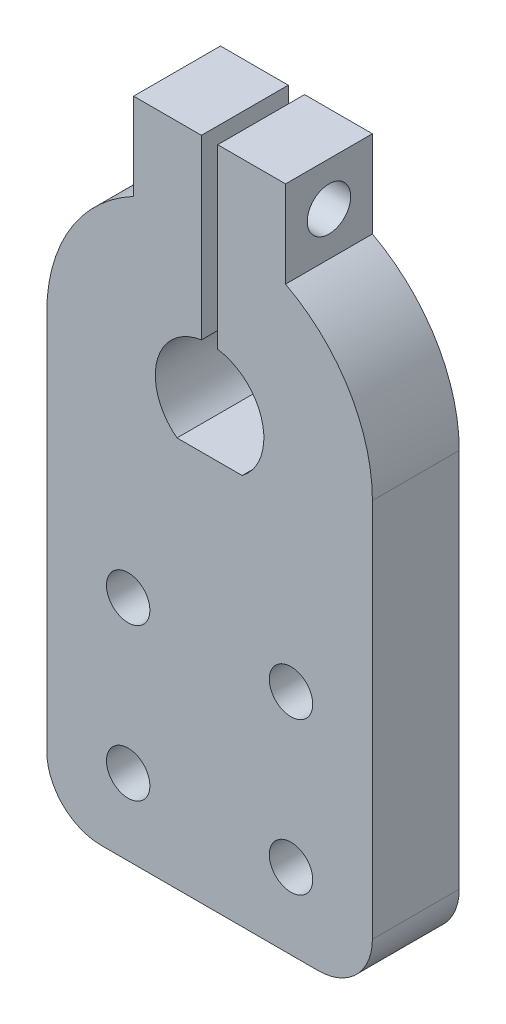
ISO-10303-21;
HEADER;
FILE_DESCRIPTION(('STEP AP214'),'2;1');
FILE_NAME('part.step','',(''),(''),'','','');
FILE_SCHEMA(('AUTOMOTIVE_DESIGN { 1 0 10303 214 1 1 1 1 }'));
ENDSEC;
DATA;
#1=APPLICATION_CONTEXT('core data for automotive mechanical design processes');
#2=APPLICATION_PROTOCOL_DEFINITION('international standard','automotive_design',2000,#1);
#3=PRODUCT_CONTEXT('',#1,'mechanical');
#4=PRODUCT('Part','Part','',(#3));
#5=PRODUCT_RELATED_PRODUCT_CATEGORY('part','',(#4));
#6=PRODUCT_DEFINITION_FORMATION('','',#4);
#7=PRODUCT_DEFINITION_CONTEXT('part definition',#1,'design');
#8=PRODUCT_DEFINITION('design','',#6,#7);
#9=PRODUCT_DEFINITION_SHAPE('','',#8);
#10=(LENGTH_UNIT() NAMED_UNIT(*) SI_UNIT(.MILLI.,.METRE.));
#11=(NAMED_UNIT(*) PLANE_ANGLE_UNIT() SI_UNIT($,.RADIAN.));
#12=(NAMED_UNIT(*) SI_UNIT($,.STERADIAN.) SOLID_ANGLE_UNIT());
#13=UNCERTAINTY_MEASURE_WITH_UNIT(LENGTH_MEASURE(1.E-05),#10,'distance_accuracy_value','');
#14=(GEOMETRIC_REPRESENTATION_CONTEXT(3) GLOBAL_UNCERTAINTY_ASSIGNED_CONTEXT((#13)) GLOBAL_UNIT_ASSIGNED_CONTEXT((#10,
#11,#12)) REPRESENTATION_CONTEXT('',''));
#15=CARTESIAN_POINT('',(0.,0.,0.));
#16=DIRECTION('',(0.,0.,1.));
#17=DIRECTION('',(1.,0.,0.));
#18=AXIS2_PLACEMENT_3D('',#15,#16,#17);
#19=CARTESIAN_POINT('',(0.,0.,8.));
#20=DIRECTION('',(0.,0.,1.));
#21=DIRECTION('',(1.,0.,0.));
#22=AXIS2_PLACEMENT_3D('',#19,#20,#21);
#23=PLANE('',#22);
#24=CARTESIAN_POINT('',(7.5,-33.,8.));
#25=DIRECTION('',(0.,0.,1.));
#26=DIRECTION('',(-1.,0.,0.));
#27=AXIS2_PLACEMENT_3D('',#24,#25,#26);
#28=CIRCLE('',#27,2.);
#29=CARTESIAN_POINT('',(5.5,-33.,8.));
#30=VERTEX_POINT('',#29);
#31=EDGE_CURVE('E549',#30,#30,#28,.T.);
#32=ORIENTED_EDGE('',*,*,#31,.F.);
#33=EDGE_LOOP('',(#32));
#34=FACE_BOUND('',#33,.T.);
#35=CARTESIAN_POINT('',(-7.5,-19.,8.));
#36=DIRECTION('',(0.,0.,1.));
#37=DIRECTION('',(1.,0.,0.));
#38=AXIS2_PLACEMENT_3D('',#35,#36,#37);
#39=CIRCLE('',#38,2.);
#40=CARTESIAN_POINT('',(-5.5,-19.,8.));
#41=VERTEX_POINT('',#40);
#42=EDGE_CURVE('E298',#41,#41,#39,.T.);
#43=ORIENTED_EDGE('',*,*,#42,.F.);
#44=EDGE_LOOP('',(#43));
#45=FACE_BOUND('',#44,.T.);
#46=DIRECTION('',(0.,-1.,0.));
#47=VECTOR('',#46,1.);
#48=CARTESIAN_POINT('',(-15.,0.,8.));
#49=LINE('',#48,#47);
#50=CARTESIAN_POINT('',(-15.,0.,8.));
#51=VERTEX_POINT('',#50);
#52=CARTESIAN_POINT('',(-15.,-35.,8.));
#53=VERTEX_POINT('',#52);
#54=EDGE_CURVE('E195',#51,#53,#49,.T.);
#55=ORIENTED_EDGE('',*,*,#54,.T.);
#56=CARTESIAN_POINT('',(-10.,-35.,8.));
#57=DIRECTION('',(0.,0.,1.));
#58=DIRECTION('',(1.,0.,0.));
#59=AXIS2_PLACEMENT_3D('',#56,#57,#58);
#60=CIRCLE('',#59,5.);
#61=CARTESIAN_POINT('',(-10.,-40.,8.));
#62=VERTEX_POINT('',#61);
#63=EDGE_CURVE('E45',#53,#62,#60,.T.);
#64=ORIENTED_EDGE('',*,*,#63,.T.);
#65=DIRECTION('',(1.,0.,0.));
#66=VECTOR('',#65,1.);
#67=CARTESIAN_POINT('',(-15.,-40.,8.));
#68=LINE('',#67,#66);
#69=CARTESIAN_POINT('',(10.,-40.,8.));
#70=VERTEX_POINT('',#69);
#71=EDGE_CURVE('E194',#62,#70,#68,.T.);
#72=ORIENTED_EDGE('',*,*,#71,.T.);
#73=CARTESIAN_POINT('',(10.,-35.,8.));
#74=DIRECTION('',(0.,0.,1.));
#75=DIRECTION('',(1.,0.,0.));
#76=AXIS2_PLACEMENT_3D('',#73,#74,#75);
#77=CIRCLE('',#76,5.);
#78=CARTESIAN_POINT('',(15.,-35.,8.));
#79=VERTEX_POINT('',#78);
#80=EDGE_CURVE('E52',#70,#79,#77,.T.);
#81=ORIENTED_EDGE('',*,*,#80,.T.);
#82=DIRECTION('',(0.,1.,0.));
#83=VECTOR('',#82,1.);
#84=CARTESIAN_POINT('',(15.,-40.,8.));
#85=LINE('',#84,#83);
#86=CARTESIAN_POINT('',(15.,0.,8.));
#87=VERTEX_POINT('',#86);
#88=EDGE_CURVE('E203',#79,#87,#85,.T.);
#89=ORIENTED_EDGE('',*,*,#88,.T.);
#90=CARTESIAN_POINT('',(0.,0.,8.));
#91=DIRECTION('',(0.,0.,1.));
#92=DIRECTION('',(1.,0.,0.));
#93=AXIS2_PLACEMENT_3D('',#90,#91,#92);
#94=CIRCLE('',#93,15.);
#95=CARTESIAN_POINT('',(7.,13.2664991614216,8.));
#96=VERTEX_POINT('',#95);
#97=EDGE_CURVE('E295',#87,#96,#94,.T.);
#98=ORIENTED_EDGE('',*,*,#97,.T.);
#99=DIRECTION('',(0.,1.,0.));
#100=VECTOR('',#99,1.);
#101=CARTESIAN_POINT('',(7.,21.2664991614216,8.));
#102=LINE('',#101,#100);
#103=CARTESIAN_POINT('',(7.,21.2664991614216,8.));
#104=VERTEX_POINT('',#103);
#105=EDGE_CURVE('E168',#96,#104,#102,.T.);
#106=ORIENTED_EDGE('',*,*,#105,.T.);
#107=DIRECTION('',(-1.,0.,0.));
#108=VECTOR('',#107,1.);
#109=CARTESIAN_POINT('',(7.,21.2664991614216,8.));
#110=LINE('',#109,#108);
#111=CARTESIAN_POINT('',(0.750000000000002,21.2664991614216,8.));
#112=VERTEX_POINT('',#111);
#113=EDGE_CURVE('E163',#104,#112,#110,.T.);
#114=ORIENTED_EDGE('',*,*,#113,.T.);
#115=DIRECTION('',(0.,-1.,0.));
#116=VECTOR('',#115,1.);
#117=CARTESIAN_POINT('',(0.750000000000002,21.2664991614216,8.));
#118=LINE('',#117,#116);
#119=CARTESIAN_POINT('',(0.750000000000002,4.9434299833213,8.));
#120=VERTEX_POINT('',#119);
#121=EDGE_CURVE('E153',#112,#120,#118,.T.);
#122=ORIENTED_EDGE('',*,*,#121,.T.);
#123=CARTESIAN_POINT('',(0.,0.,8.));
#124=DIRECTION('',(0.,0.,-1.));
#125=DIRECTION('',(1.,0.,0.));
#126=AXIS2_PLACEMENT_3D('',#123,#124,#125);
#127=CIRCLE('',#126,5.);
#128=CARTESIAN_POINT('',(3.,-4.,8.));
#129=VERTEX_POINT('',#128);
#130=EDGE_CURVE('E162',#120,#129,#127,.T.);
#131=ORIENTED_EDGE('',*,*,#130,.T.);
#132=DIRECTION('',(-1.,0.,0.));
#133=VECTOR('',#132,1.);
#134=CARTESIAN_POINT('',(3.,-4.,8.));
#135=LINE('',#134,#133);
#136=CARTESIAN_POINT('',(-3.,-4.,8.));
#137=VERTEX_POINT('',#136);
#138=EDGE_CURVE('E260',#129,#137,#135,.T.);
#139=ORIENTED_EDGE('',*,*,#138,.T.);
#140=CARTESIAN_POINT('',(0.,0.,8.));
#141=DIRECTION('',(0.,0.,-1.));
#142=DIRECTION('',(1.,0.,0.));
#143=AXIS2_PLACEMENT_3D('',#140,#141,#142);
#144=CIRCLE('',#143,5.);
#145=CARTESIAN_POINT('',(-0.75,4.9434299833213,8.));
#146=VERTEX_POINT('',#145);
#147=EDGE_CURVE('E301',#137,#146,#144,.T.);
#148=ORIENTED_EDGE('',*,*,#147,.T.);
#149=DIRECTION('',(0.,1.,0.));
#150=VECTOR('',#149,1.);
#151=CARTESIAN_POINT('',(-0.750000000000002,21.2664991614216,8.));
#152=LINE('',#151,#150);
#153=CARTESIAN_POINT('',(-0.750000000000002,21.2664991614216,8.));
#154=VERTEX_POINT('',#153);
#155=EDGE_CURVE('E305',#146,#154,#152,.T.);
#156=ORIENTED_EDGE('',*,*,#155,.T.);
#157=DIRECTION('',(-1.,0.,0.));
#158=VECTOR('',#157,1.);
#159=CARTESIAN_POINT('',(-7.,21.2664991614216,8.));
#160=LINE('',#159,#158);
#161=CARTESIAN_POINT('',(-7.,21.2664991614216,8.));
#162=VERTEX_POINT('',#161);
#163=EDGE_CURVE('E290',#154,#162,#160,.T.);
#164=ORIENTED_EDGE('',*,*,#163,.T.);
#165=DIRECTION('',(0.,-1.,0.));
#166=VECTOR('',#165,1.);
#167=CARTESIAN_POINT('',(-7.,21.2664991614216,8.));
#168=LINE('',#167,#166);
#169=CARTESIAN_POINT('',(-7.,13.2664991614216,8.));
#170=VERTEX_POINT('',#169);
#171=EDGE_CURVE('E287',#162,#170,#168,.T.);
#172=ORIENTED_EDGE('',*,*,#171,.T.);
#173=CARTESIAN_POINT('',(0.,0.,8.));
#174=DIRECTION('',(0.,0.,1.));
#175=DIRECTION('',(1.,0.,0.));
#176=AXIS2_PLACEMENT_3D('',#173,#174,#175);
#177=CIRCLE('',#176,15.);
#178=EDGE_CURVE('E286',#170,#51,#177,.T.);
#179=ORIENTED_EDGE('',*,*,#178,.T.);
#180=EDGE_LOOP('',(#55,#64,#72,#81,#89,#98,#106,#114,#122,#131,#139,#148,#156,#164,#172,#179));
#181=FACE_BOUND('',#180,.T.);
#182=CARTESIAN_POINT('',(-7.5,-33.,8.));
#183=DIRECTION('',(0.,0.,1.));
#184=DIRECTION('',(1.,0.,0.));
#185=AXIS2_PLACEMENT_3D('',#182,#183,#184);
#186=CIRCLE('',#185,2.);
#187=CARTESIAN_POINT('',(-5.5,-33.,8.));
#188=VERTEX_POINT('',#187);
#189=EDGE_CURVE('E555',#188,#188,#186,.T.);
#190=ORIENTED_EDGE('',*,*,#189,.F.);
#191=EDGE_LOOP('',(#190));
#192=FACE_BOUND('',#191,.T.);
#193=CARTESIAN_POINT('',(7.5,-19.,8.));
#194=DIRECTION('',(0.,0.,1.));
#195=DIRECTION('',(-1.,0.,0.));
#196=AXIS2_PLACEMENT_3D('',#193,#194,#195);
#197=CIRCLE('',#196,2.);
#198=CARTESIAN_POINT('',(5.5,-19.,8.));
#199=VERTEX_POINT('',#198);
#200=EDGE_CURVE('E539',#199,#199,#197,.T.);
#201=ORIENTED_EDGE('',*,*,#200,.F.);
#202=EDGE_LOOP('',(#201));
#203=FACE_BOUND('',#202,.T.);
#204=ADVANCED_FACE('F37',(#34,#45,#181,#192,#203),#23,.T.);
#205=CARTESIAN_POINT('',(0.,0.,0.));
#206=DIRECTION('',(0.,0.,1.));
#207=DIRECTION('',(1.,0.,0.));
#208=AXIS2_PLACEMENT_3D('',#205,#206,#207);
#209=PLANE('',#208);
#210=DIRECTION('',(1.,0.,0.));
#211=VECTOR('',#210,1.);
#212=CARTESIAN_POINT('',(-15.,-40.,0.));
#213=LINE('',#212,#211);
#214=CARTESIAN_POINT('',(-10.,-40.,0.));
#215=VERTEX_POINT('',#214);
#216=CARTESIAN_POINT('',(10.,-40.,0.));
#217=VERTEX_POINT('',#216);
#218=EDGE_CURVE('E212',#215,#217,#213,.T.);
#219=ORIENTED_EDGE('',*,*,#218,.F.);
#220=CARTESIAN_POINT('',(-10.,-35.,0.));
#221=DIRECTION('',(0.,0.,1.));
#222=DIRECTION('',(1.,0.,0.));
#223=AXIS2_PLACEMENT_3D('',#220,#221,#222);
#224=CIRCLE('',#223,5.);
#225=CARTESIAN_POINT('',(-15.,-35.,0.));
#226=VERTEX_POINT('',#225);
#227=EDGE_CURVE('E189',#215,#226,#224,.F.);
#228=ORIENTED_EDGE('',*,*,#227,.T.);
#229=DIRECTION('',(0.,-1.,0.));
#230=VECTOR('',#229,1.);
#231=CARTESIAN_POINT('',(-15.,0.,0.));
#232=LINE('',#231,#230);
#233=CARTESIAN_POINT('',(-15.,0.,0.));
#234=VERTEX_POINT('',#233);
#235=EDGE_CURVE('E211',#234,#226,#232,.T.);
#236=ORIENTED_EDGE('',*,*,#235,.F.);
#237=CARTESIAN_POINT('',(0.,0.,0.));
#238=DIRECTION('',(0.,0.,1.));
#239=DIRECTION('',(1.,0.,0.));
#240=AXIS2_PLACEMENT_3D('',#237,#238,#239);
#241=CIRCLE('',#240,15.);
#242=CARTESIAN_POINT('',(-7.,13.2664991614216,0.));
#243=VERTEX_POINT('',#242);
#244=EDGE_CURVE('E217',#243,#234,#241,.T.);
#245=ORIENTED_EDGE('',*,*,#244,.F.);
#246=DIRECTION('',(0.,-1.,0.));
#247=VECTOR('',#246,1.);
#248=CARTESIAN_POINT('',(-7.,21.2664991614216,0.));
#249=LINE('',#248,#247);
#250=CARTESIAN_POINT('',(-7.,21.2664991614216,0.));
#251=VERTEX_POINT('',#250);
#252=EDGE_CURVE('E221',#251,#243,#249,.T.);
#253=ORIENTED_EDGE('',*,*,#252,.F.);
#254=DIRECTION('',(-1.,0.,0.));
#255=VECTOR('',#254,1.);
#256=CARTESIAN_POINT('',(-7.,21.2664991614216,0.));
#257=LINE('',#256,#255);
#258=CARTESIAN_POINT('',(-0.750000000000002,21.2664991614216,0.));
#259=VERTEX_POINT('',#258);
#260=EDGE_CURVE('E275',#259,#251,#257,.T.);
#261=ORIENTED_EDGE('',*,*,#260,.F.);
#262=DIRECTION('',(0.,1.,0.));
#263=VECTOR('',#262,1.);
#264=CARTESIAN_POINT('',(-0.750000000000002,21.2664991614216,0.));
#265=LINE('',#264,#263);
#266=CARTESIAN_POINT('',(-0.75,4.9434299833213,0.));
#267=VERTEX_POINT('',#266);
#268=EDGE_CURVE('E268',#267,#259,#265,.T.);
#269=ORIENTED_EDGE('',*,*,#268,.F.);
#270=CARTESIAN_POINT('',(0.,0.,0.));
#271=DIRECTION('',(0.,0.,-1.));
#272=DIRECTION('',(1.,0.,0.));
#273=AXIS2_PLACEMENT_3D('',#270,#271,#272);
#274=CIRCLE('',#273,5.);
#275=CARTESIAN_POINT('',(-3.,-4.,0.));
#276=VERTEX_POINT('',#275);
#277=EDGE_CURVE('E266',#276,#267,#274,.T.);
#278=ORIENTED_EDGE('',*,*,#277,.F.);
#279=DIRECTION('',(-1.,0.,0.));
#280=VECTOR('',#279,1.);
#281=CARTESIAN_POINT('',(3.,-4.,0.));
#282=LINE('',#281,#280);
#283=CARTESIAN_POINT('',(3.,-4.,0.));
#284=VERTEX_POINT('',#283);
#285=EDGE_CURVE('E259',#284,#276,#282,.T.);
#286=ORIENTED_EDGE('',*,*,#285,.F.);
#287=CARTESIAN_POINT('',(0.,0.,0.));
#288=DIRECTION('',(0.,0.,-1.));
#289=DIRECTION('',(1.,0.,0.));
#290=AXIS2_PLACEMENT_3D('',#287,#288,#289);
#291=CIRCLE('',#290,5.);
#292=CARTESIAN_POINT('',(0.750000000000002,4.9434299833213,0.));
#293=VERTEX_POINT('',#292);
#294=EDGE_CURVE('E264',#293,#284,#291,.T.);
#295=ORIENTED_EDGE('',*,*,#294,.F.);
#296=DIRECTION('',(0.,-1.,0.));
#297=VECTOR('',#296,1.);
#298=CARTESIAN_POINT('',(0.750000000000002,21.2664991614216,0.));
#299=LINE('',#298,#297);
#300=CARTESIAN_POINT('',(0.750000000000002,21.2664991614216,0.));
#301=VERTEX_POINT('',#300);
#302=EDGE_CURVE('E270',#301,#293,#299,.T.);
#303=ORIENTED_EDGE('',*,*,#302,.F.);
#304=DIRECTION('',(-1.,0.,0.));
#305=VECTOR('',#304,1.);
#306=CARTESIAN_POINT('',(7.,21.2664991614216,0.));
#307=LINE('',#306,#305);
#308=CARTESIAN_POINT('',(7.,21.2664991614216,0.));
#309=VERTEX_POINT('',#308);
#310=EDGE_CURVE('E176',#309,#301,#307,.T.);
#311=ORIENTED_EDGE('',*,*,#310,.F.);
#312=DIRECTION('',(0.,1.,0.));
#313=VECTOR('',#312,1.);
#314=CARTESIAN_POINT('',(7.,21.2664991614216,0.));
#315=LINE('',#314,#313);
#316=CARTESIAN_POINT('',(7.,13.2664991614216,0.));
#317=VERTEX_POINT('',#316);
#318=EDGE_CURVE('E172',#317,#309,#315,.T.);
#319=ORIENTED_EDGE('',*,*,#318,.F.);
#320=CARTESIAN_POINT('',(0.,0.,0.));
#321=DIRECTION('',(0.,0.,1.));
#322=DIRECTION('',(1.,0.,0.));
#323=AXIS2_PLACEMENT_3D('',#320,#321,#322);
#324=CIRCLE('',#323,15.);
#325=CARTESIAN_POINT('',(15.,0.,0.));
#326=VERTEX_POINT('',#325);
#327=EDGE_CURVE('E226',#326,#317,#324,.T.);
#328=ORIENTED_EDGE('',*,*,#327,.F.);
#329=DIRECTION('',(0.,1.,0.));
#330=VECTOR('',#329,1.);
#331=CARTESIAN_POINT('',(15.,-40.,0.));
#332=LINE('',#331,#330);
#333=CARTESIAN_POINT('',(15.,-35.,0.));
#334=VERTEX_POINT('',#333);
#335=EDGE_CURVE('E219',#334,#326,#332,.T.);
#336=ORIENTED_EDGE('',*,*,#335,.F.);
#337=CARTESIAN_POINT('',(10.,-35.,0.));
#338=DIRECTION('',(0.,0.,1.));
#339=DIRECTION('',(1.,0.,0.));
#340=AXIS2_PLACEMENT_3D('',#337,#338,#339);
#341=CIRCLE('',#340,5.);
#342=EDGE_CURVE('E187',#334,#217,#341,.F.);
#343=ORIENTED_EDGE('',*,*,#342,.T.);
#344=EDGE_LOOP('',(#219,#228,#236,#245,#253,#261,#269,#278,#286,#295,#303,#311,#319,#328,#336,#343));
#345=FACE_BOUND('',#344,.T.);
#346=CARTESIAN_POINT('',(-7.5,-19.,0.));
#347=DIRECTION('',(0.,0.,1.));
#348=DIRECTION('',(1.,0.,0.));
#349=AXIS2_PLACEMENT_3D('',#346,#347,#348);
#350=CIRCLE('',#349,2.);
#351=CARTESIAN_POINT('',(-5.5,-19.,0.));
#352=VERTEX_POINT('',#351);
#353=EDGE_CURVE('E558',#352,#352,#350,.T.);
#354=ORIENTED_EDGE('',*,*,#353,.T.);
#355=EDGE_LOOP('',(#354));
#356=FACE_BOUND('',#355,.T.);
#357=CARTESIAN_POINT('',(-7.5,-33.,0.));
#358=DIRECTION('',(0.,0.,1.));
#359=DIRECTION('',(1.,0.,0.));
#360=AXIS2_PLACEMENT_3D('',#357,#358,#359);
#361=CIRCLE('',#360,2.);
#362=CARTESIAN_POINT('',(-5.5,-33.,0.));
#363=VERTEX_POINT('',#362);
#364=EDGE_CURVE('E552',#363,#363,#361,.T.);
#365=ORIENTED_EDGE('',*,*,#364,.T.);
#366=EDGE_LOOP('',(#365));
#367=FACE_BOUND('',#366,.T.);
#368=CARTESIAN_POINT('',(7.5,-33.,0.));
#369=DIRECTION('',(0.,0.,1.));
#370=DIRECTION('',(-1.,0.,0.));
#371=AXIS2_PLACEMENT_3D('',#368,#369,#370);
#372=CIRCLE('',#371,2.);
#373=CARTESIAN_POINT('',(5.5,-33.,0.));
#374=VERTEX_POINT('',#373);
#375=EDGE_CURVE('E547',#374,#374,#372,.T.);
#376=ORIENTED_EDGE('',*,*,#375,.T.);
#377=EDGE_LOOP('',(#376));
#378=FACE_BOUND('',#377,.T.);
#379=CARTESIAN_POINT('',(7.5,-19.,0.));
#380=DIRECTION('',(0.,0.,1.));
#381=DIRECTION('',(-1.,0.,0.));
#382=AXIS2_PLACEMENT_3D('',#379,#380,#381);
#383=CIRCLE('',#382,2.);
#384=CARTESIAN_POINT('',(5.5,-19.,0.));
#385=VERTEX_POINT('',#384);
#386=EDGE_CURVE('E535',#385,#385,#383,.T.);
#387=ORIENTED_EDGE('',*,*,#386,.T.);
#388=EDGE_LOOP('',(#387));
#389=FACE_BOUND('',#388,.T.);
#390=ADVANCED_FACE('F208',(#345,#356,#367,#378,#389),#209,.F.);
#391=CARTESIAN_POINT('',(7.,21.2664991614216,8.));
#392=DIRECTION('',(0.,-1.,0.));
#393=DIRECTION('',(0.,0.,-1.));
#394=AXIS2_PLACEMENT_3D('',#391,#392,#393);
#395=PLANE('',#394);
#396=ORIENTED_EDGE('',*,*,#310,.T.);
#397=DIRECTION('',(0.,0.,-1.));
#398=VECTOR('',#397,1.);
#399=CARTESIAN_POINT('',(0.750000000000002,21.2664991614216,8.));
#400=LINE('',#399,#398);
#401=EDGE_CURVE('E157',#112,#301,#400,.T.);
#402=ORIENTED_EDGE('',*,*,#401,.F.);
#403=ORIENTED_EDGE('',*,*,#113,.F.);
#404=DIRECTION('',(0.,0.,-1.));
#405=VECTOR('',#404,1.);
#406=CARTESIAN_POINT('',(7.,21.2664991614216,8.));
#407=LINE('',#406,#405);
#408=EDGE_CURVE('E229',#104,#309,#407,.T.);
#409=ORIENTED_EDGE('',*,*,#408,.T.);
#410=EDGE_LOOP('',(#396,#402,#403,#409));
#411=FACE_BOUND('',#410,.T.);
#412=ADVANCED_FACE('F174',(#411),#395,.F.);
#413=CARTESIAN_POINT('',(0.750000000000002,21.2664991614216,8.));
#414=DIRECTION('',(1.,0.,0.));
#415=DIRECTION('',(0.,1.,0.));
#416=AXIS2_PLACEMENT_3D('',#413,#414,#415);
#417=PLANE('',#416);
#418=CARTESIAN_POINT('',(0.750000000000002,17.2664991614216,4.));
#419=DIRECTION('',(1.,0.,0.));
#420=DIRECTION('',(0.,1.,0.));
#421=AXIS2_PLACEMENT_3D('',#418,#419,#420);
#422=CIRCLE('',#421,2.);
#423=CARTESIAN_POINT('',(0.750000000000003,19.2664991614216,4.));
#424=VERTEX_POINT('',#423);
#425=EDGE_CURVE('E533',#424,#424,#422,.T.);
#426=ORIENTED_EDGE('',*,*,#425,.T.);
#427=EDGE_LOOP('',(#426));
#428=FACE_BOUND('',#427,.T.);
#429=ORIENTED_EDGE('',*,*,#302,.T.);
#430=DIRECTION('',(0.,0.,-1.));
#431=VECTOR('',#430,1.);
#432=CARTESIAN_POINT('',(0.750000000000002,4.9434299833213,8.));
#433=LINE('',#432,#431);
#434=EDGE_CURVE('E160',#120,#293,#433,.T.);
#435=ORIENTED_EDGE('',*,*,#434,.F.);
#436=ORIENTED_EDGE('',*,*,#121,.F.);
#437=ORIENTED_EDGE('',*,*,#401,.T.);
#438=EDGE_LOOP('',(#429,#435,#436,#437));
#439=FACE_BOUND('',#438,.T.);
#440=ADVANCED_FACE('F155',(#428,#439),#417,.F.);
#441=CARTESIAN_POINT('',(0.,0.,8.));
#442=DIRECTION('',(0.,0.,-1.));
#443=DIRECTION('',(-1.,0.,0.));
#444=AXIS2_PLACEMENT_3D('',#441,#442,#443);
#445=CYLINDRICAL_SURFACE('',#444,5.);
#446=ORIENTED_EDGE('',*,*,#294,.T.);
#447=DIRECTION('',(0.,0.,-1.));
#448=VECTOR('',#447,1.);
#449=CARTESIAN_POINT('',(3.,-4.,8.));
#450=LINE('',#449,#448);
#451=EDGE_CURVE('E181',#129,#284,#450,.T.);
#452=ORIENTED_EDGE('',*,*,#451,.F.);
#453=ORIENTED_EDGE('',*,*,#130,.F.);
#454=ORIENTED_EDGE('',*,*,#434,.T.);
#455=EDGE_LOOP('',(#446,#452,#453,#454));
#456=FACE_BOUND('',#455,.T.);
#457=ADVANCED_FACE('F299',(#456),#445,.F.);
#458=CARTESIAN_POINT('',(3.,-4.,8.));
#459=DIRECTION('',(0.,-1.,0.));
#460=DIRECTION('',(0.,0.,-1.));
#461=AXIS2_PLACEMENT_3D('',#458,#459,#460);
#462=PLANE('',#461);
#463=ORIENTED_EDGE('',*,*,#285,.T.);
#464=DIRECTION('',(0.,0.,-1.));
#465=VECTOR('',#464,1.);
#466=CARTESIAN_POINT('',(-3.,-4.,8.));
#467=LINE('',#466,#465);
#468=EDGE_CURVE('E250',#137,#276,#467,.T.);
#469=ORIENTED_EDGE('',*,*,#468,.F.);
#470=ORIENTED_EDGE('',*,*,#138,.F.);
#471=ORIENTED_EDGE('',*,*,#451,.T.);
#472=EDGE_LOOP('',(#463,#469,#470,#471));
#473=FACE_BOUND('',#472,.T.);
#474=ADVANCED_FACE('F257',(#473),#462,.F.);
#475=CARTESIAN_POINT('',(0.,0.,8.));
#476=DIRECTION('',(0.,0.,-1.));
#477=DIRECTION('',(-1.,0.,0.));
#478=AXIS2_PLACEMENT_3D('',#475,#476,#477);
#479=CYLINDRICAL_SURFACE('',#478,5.);
#480=ORIENTED_EDGE('',*,*,#277,.T.);
#481=DIRECTION('',(0.,0.,-1.));
#482=VECTOR('',#481,1.);
#483=CARTESIAN_POINT('',(-0.75,4.9434299833213,8.));
#484=LINE('',#483,#482);
#485=EDGE_CURVE('E247',#146,#267,#484,.T.);
#486=ORIENTED_EDGE('',*,*,#485,.F.);
#487=ORIENTED_EDGE('',*,*,#147,.F.);
#488=ORIENTED_EDGE('',*,*,#468,.T.);
#489=EDGE_LOOP('',(#480,#486,#487,#488));
#490=FACE_BOUND('',#489,.T.);
#491=ADVANCED_FACE('F316',(#490),#479,.F.);
#492=CARTESIAN_POINT('',(-0.750000000000002,21.2664991614216,8.));
#493=DIRECTION('',(-1.,0.,0.));
#494=DIRECTION('',(0.,-1.,0.));
#495=AXIS2_PLACEMENT_3D('',#492,#493,#494);
#496=PLANE('',#495);
#497=CARTESIAN_POINT('',(-0.750000000000002,17.2664991614216,4.));
#498=DIRECTION('',(-1.,0.,0.));
#499=DIRECTION('',(0.,-1.,0.));
#500=AXIS2_PLACEMENT_3D('',#497,#498,#499);
#501=CIRCLE('',#500,2.);
#502=CARTESIAN_POINT('',(-0.750000000000001,15.2664991614216,4.));
#503=VERTEX_POINT('',#502);
#504=EDGE_CURVE('E536',#503,#503,#501,.T.);
#505=ORIENTED_EDGE('',*,*,#504,.T.);
#506=EDGE_LOOP('',(#505));
#507=FACE_BOUND('',#506,.T.);
#508=ORIENTED_EDGE('',*,*,#268,.T.);
#509=DIRECTION('',(0.,0.,-1.));
#510=VECTOR('',#509,1.);
#511=CARTESIAN_POINT('',(-0.750000000000002,21.2664991614216,8.));
#512=LINE('',#511,#510);
#513=EDGE_CURVE('E244',#154,#259,#512,.T.);
#514=ORIENTED_EDGE('',*,*,#513,.F.);
#515=ORIENTED_EDGE('',*,*,#155,.F.);
#516=ORIENTED_EDGE('',*,*,#485,.T.);
#517=EDGE_LOOP('',(#508,#514,#515,#516));
#518=FACE_BOUND('',#517,.T.);
#519=ADVANCED_FACE('F312',(#507,#518),#496,.F.);
#520=CARTESIAN_POINT('',(-7.,21.2664991614216,8.));
#521=DIRECTION('',(0.,-1.,0.));
#522=DIRECTION('',(0.,0.,-1.));
#523=AXIS2_PLACEMENT_3D('',#520,#521,#522);
#524=PLANE('',#523);
#525=ORIENTED_EDGE('',*,*,#260,.T.);
#526=DIRECTION('',(0.,0.,-1.));
#527=VECTOR('',#526,1.);
#528=CARTESIAN_POINT('',(-7.,21.2664991614216,8.));
#529=LINE('',#528,#527);
#530=EDGE_CURVE('E241',#162,#251,#529,.T.);
#531=ORIENTED_EDGE('',*,*,#530,.F.);
#532=ORIENTED_EDGE('',*,*,#163,.F.);
#533=ORIENTED_EDGE('',*,*,#513,.T.);
#534=EDGE_LOOP('',(#525,#531,#532,#533));
#535=FACE_BOUND('',#534,.T.);
#536=ADVANCED_FACE('F310',(#535),#524,.F.);
#537=CARTESIAN_POINT('',(-7.,21.2664991614216,8.));
#538=DIRECTION('',(1.,0.,0.));
#539=DIRECTION('',(0.,1.,0.));
#540=AXIS2_PLACEMENT_3D('',#537,#538,#539);
#541=PLANE('',#540);
#542=CARTESIAN_POINT('',(-7.,17.2664991614216,4.));
#543=DIRECTION('',(1.,0.,0.));
#544=DIRECTION('',(0.,1.,0.));
#545=AXIS2_PLACEMENT_3D('',#542,#543,#544);
#546=CIRCLE('',#545,2.);
#547=CARTESIAN_POINT('',(-7.,19.2664991614216,4.));
#548=VERTEX_POINT('',#547);
#549=EDGE_CURVE('E542',#548,#548,#546,.T.);
#550=ORIENTED_EDGE('',*,*,#549,.T.);
#551=EDGE_LOOP('',(#550));
#552=FACE_BOUND('',#551,.T.);
#553=ORIENTED_EDGE('',*,*,#252,.T.);
#554=DIRECTION('',(0.,0.,-1.));
#555=VECTOR('',#554,1.);
#556=CARTESIAN_POINT('',(-7.,13.2664991614216,8.));
#557=LINE('',#556,#555);
#558=EDGE_CURVE('E238',#170,#243,#557,.T.);
#559=ORIENTED_EDGE('',*,*,#558,.F.);
#560=ORIENTED_EDGE('',*,*,#171,.F.);
#561=ORIENTED_EDGE('',*,*,#530,.T.);
#562=EDGE_LOOP('',(#553,#559,#560,#561));
#563=FACE_BOUND('',#562,.T.);
#564=ADVANCED_FACE('F279',(#552,#563),#541,.F.);
#565=CARTESIAN_POINT('',(0.,0.,8.));
#566=DIRECTION('',(0.,0.,-1.));
#567=DIRECTION('',(-1.,0.,0.));
#568=AXIS2_PLACEMENT_3D('',#565,#566,#567);
#569=CYLINDRICAL_SURFACE('',#568,15.);
#570=ORIENTED_EDGE('',*,*,#244,.T.);
#571=DIRECTION('',(0.,0.,-1.));
#572=VECTOR('',#571,1.);
#573=CARTESIAN_POINT('',(-15.,0.,8.));
#574=LINE('',#573,#572);
#575=EDGE_CURVE('E216',#51,#234,#574,.T.);
#576=ORIENTED_EDGE('',*,*,#575,.F.);
#577=ORIENTED_EDGE('',*,*,#178,.F.);
#578=ORIENTED_EDGE('',*,*,#558,.T.);
#579=EDGE_LOOP('',(#570,#576,#577,#578));
#580=FACE_BOUND('',#579,.T.);
#581=ADVANCED_FACE('F285',(#580),#569,.T.);
#582=CARTESIAN_POINT('',(-15.,0.,8.));
#583=DIRECTION('',(1.,0.,0.));
#584=DIRECTION('',(0.,0.,-1.));
#585=AXIS2_PLACEMENT_3D('',#582,#583,#584);
#586=PLANE('',#585);
#587=ORIENTED_EDGE('',*,*,#235,.T.);
#588=DIRECTION('',(0.,0.,-1.));
#589=VECTOR('',#588,1.);
#590=CARTESIAN_POINT('',(-15.,-35.,8.));
#591=LINE('',#590,#589);
#592=EDGE_CURVE('E60',#226,#53,#591,.F.);
#593=ORIENTED_EDGE('',*,*,#592,.T.);
#594=ORIENTED_EDGE('',*,*,#54,.F.);
#595=ORIENTED_EDGE('',*,*,#575,.T.);
#596=EDGE_LOOP('',(#587,#593,#594,#595));
#597=FACE_BOUND('',#596,.T.);
#598=ADVANCED_FACE('F214',(#597),#586,.F.);
#599=CARTESIAN_POINT('',(-15.,-40.,8.));
#600=DIRECTION('',(0.,1.,0.));
#601=DIRECTION('',(0.,0.,1.));
#602=AXIS2_PLACEMENT_3D('',#599,#600,#601);
#603=PLANE('',#602);
#604=ORIENTED_EDGE('',*,*,#71,.F.);
#605=DIRECTION('',(0.,0.,-1.));
#606=VECTOR('',#605,1.);
#607=CARTESIAN_POINT('',(-10.,-40.,8.));
#608=LINE('',#607,#606);
#609=EDGE_CURVE('E179',#62,#215,#608,.T.);
#610=ORIENTED_EDGE('',*,*,#609,.T.);
#611=ORIENTED_EDGE('',*,*,#218,.T.);
#612=DIRECTION('',(0.,0.,-1.));
#613=VECTOR('',#612,1.);
#614=CARTESIAN_POINT('',(10.,-40.,8.));
#615=LINE('',#614,#613);
#616=EDGE_CURVE('E177',#217,#70,#615,.F.);
#617=ORIENTED_EDGE('',*,*,#616,.T.);
#618=EDGE_LOOP('',(#604,#610,#611,#617));
#619=FACE_BOUND('',#618,.T.);
#620=ADVANCED_FACE('F199',(#619),#603,.F.);
#621=CARTESIAN_POINT('',(15.,-40.,8.));
#622=DIRECTION('',(-1.,0.,0.));
#623=DIRECTION('',(0.,0.,1.));
#624=AXIS2_PLACEMENT_3D('',#621,#622,#623);
#625=PLANE('',#624);
#626=ORIENTED_EDGE('',*,*,#88,.F.);
#627=DIRECTION('',(0.,0.,-1.));
#628=VECTOR('',#627,1.);
#629=CARTESIAN_POINT('',(15.,-35.,8.));
#630=LINE('',#629,#628);
#631=EDGE_CURVE('E11',#79,#334,#630,.T.);
#632=ORIENTED_EDGE('',*,*,#631,.T.);
#633=ORIENTED_EDGE('',*,*,#335,.T.);
#634=DIRECTION('',(0.,0.,-1.));
#635=VECTOR('',#634,1.);
#636=CARTESIAN_POINT('',(15.,0.,8.));
#637=LINE('',#636,#635);
#638=EDGE_CURVE('E234',#87,#326,#637,.T.);
#639=ORIENTED_EDGE('',*,*,#638,.F.);
#640=EDGE_LOOP('',(#626,#632,#633,#639));
#641=FACE_BOUND('',#640,.T.);
#642=ADVANCED_FACE('F346',(#641),#625,.F.);
#643=CARTESIAN_POINT('',(0.,0.,8.));
#644=DIRECTION('',(0.,0.,-1.));
#645=DIRECTION('',(-1.,0.,0.));
#646=AXIS2_PLACEMENT_3D('',#643,#644,#645);
#647=CYLINDRICAL_SURFACE('',#646,15.);
#648=ORIENTED_EDGE('',*,*,#327,.T.);
#649=DIRECTION('',(0.,0.,-1.));
#650=VECTOR('',#649,1.);
#651=CARTESIAN_POINT('',(7.,13.2664991614216,8.));
#652=LINE('',#651,#650);
#653=EDGE_CURVE('E231',#96,#317,#652,.T.);
#654=ORIENTED_EDGE('',*,*,#653,.F.);
#655=ORIENTED_EDGE('',*,*,#97,.F.);
#656=ORIENTED_EDGE('',*,*,#638,.T.);
#657=EDGE_LOOP('',(#648,#654,#655,#656));
#658=FACE_BOUND('',#657,.T.);
#659=ADVANCED_FACE('F342',(#658),#647,.T.);
#660=CARTESIAN_POINT('',(7.,21.2664991614216,8.));
#661=DIRECTION('',(-1.,0.,0.));
#662=DIRECTION('',(0.,-1.,0.));
#663=AXIS2_PLACEMENT_3D('',#660,#661,#662);
#664=PLANE('',#663);
#665=CARTESIAN_POINT('',(7.,17.2664991614216,4.));
#666=DIRECTION('',(1.,0.,0.));
#667=DIRECTION('',(0.,0.,-1.));
#668=AXIS2_PLACEMENT_3D('',#665,#666,#667);
#669=CIRCLE('',#668,2.);
#670=CARTESIAN_POINT('',(7.,17.2664991614216,2.));
#671=VERTEX_POINT('',#670);
#672=EDGE_CURVE('E581',#671,#671,#669,.T.);
#673=ORIENTED_EDGE('',*,*,#672,.F.);
#674=EDGE_LOOP('',(#673));
#675=FACE_BOUND('',#674,.T.);
#676=ORIENTED_EDGE('',*,*,#318,.T.);
#677=ORIENTED_EDGE('',*,*,#408,.F.);
#678=ORIENTED_EDGE('',*,*,#105,.F.);
#679=ORIENTED_EDGE('',*,*,#653,.T.);
#680=EDGE_LOOP('',(#676,#677,#678,#679));
#681=FACE_BOUND('',#680,.T.);
#682=ADVANCED_FACE('F339',(#675,#681),#664,.F.);
#683=CARTESIAN_POINT('',(-7.5,-19.,8.));
#684=DIRECTION('',(0.,0.,-1.));
#685=DIRECTION('',(-1.,0.,0.));
#686=AXIS2_PLACEMENT_3D('',#683,#684,#685);
#687=CYLINDRICAL_SURFACE('',#686,2.);
#688=ORIENTED_EDGE('',*,*,#42,.T.);
#689=EDGE_LOOP('',(#688));
#690=FACE_BOUND('',#689,.T.);
#691=ORIENTED_EDGE('',*,*,#353,.F.);
#692=EDGE_LOOP('',(#691));
#693=FACE_BOUND('',#692,.T.);
#694=ADVANCED_FACE('F336',(#690,#693),#687,.F.);
#695=CARTESIAN_POINT('',(-7.5,-33.,8.));
#696=DIRECTION('',(0.,0.,-1.));
#697=DIRECTION('',(-1.,0.,0.));
#698=AXIS2_PLACEMENT_3D('',#695,#696,#697);
#699=CYLINDRICAL_SURFACE('',#698,2.);
#700=ORIENTED_EDGE('',*,*,#189,.T.);
#701=EDGE_LOOP('',(#700));
#702=FACE_BOUND('',#701,.T.);
#703=ORIENTED_EDGE('',*,*,#364,.F.);
#704=EDGE_LOOP('',(#703));
#705=FACE_BOUND('',#704,.T.);
#706=ADVANCED_FACE('F402',(#702,#705),#699,.F.);
#707=CARTESIAN_POINT('',(7.5,-33.,8.));
#708=DIRECTION('',(0.,0.,-1.));
#709=DIRECTION('',(-1.,0.,0.));
#710=AXIS2_PLACEMENT_3D('',#707,#708,#709);
#711=CYLINDRICAL_SURFACE('',#710,2.);
#712=ORIENTED_EDGE('',*,*,#31,.T.);
#713=EDGE_LOOP('',(#712));
#714=FACE_BOUND('',#713,.T.);
#715=ORIENTED_EDGE('',*,*,#375,.F.);
#716=EDGE_LOOP('',(#715));
#717=FACE_BOUND('',#716,.T.);
#718=ADVANCED_FACE('F409',(#714,#717),#711,.F.);
#719=CARTESIAN_POINT('',(7.5,-19.,8.));
#720=DIRECTION('',(0.,0.,-1.));
#721=DIRECTION('',(-1.,0.,0.));
#722=AXIS2_PLACEMENT_3D('',#719,#720,#721);
#723=CYLINDRICAL_SURFACE('',#722,2.);
#724=ORIENTED_EDGE('',*,*,#200,.T.);
#725=EDGE_LOOP('',(#724));
#726=FACE_BOUND('',#725,.T.);
#727=ORIENTED_EDGE('',*,*,#386,.F.);
#728=EDGE_LOOP('',(#727));
#729=FACE_BOUND('',#728,.T.);
#730=ADVANCED_FACE('F416',(#726,#729),#723,.F.);
#731=CARTESIAN_POINT('',(-8.,17.2664991614216,4.));
#732=DIRECTION('',(1.,0.,0.));
#733=DIRECTION('',(0.,0.,-1.));
#734=AXIS2_PLACEMENT_3D('',#731,#732,#733);
#735=CYLINDRICAL_SURFACE('',#734,2.);
#736=ORIENTED_EDGE('',*,*,#672,.T.);
#737=EDGE_LOOP('',(#736));
#738=FACE_BOUND('',#737,.T.);
#739=ORIENTED_EDGE('',*,*,#425,.F.);
#740=EDGE_LOOP('',(#739));
#741=FACE_BOUND('',#740,.T.);
#742=ADVANCED_FACE('F424',(#738,#741),#735,.F.);
#743=ORIENTED_EDGE('',*,*,#549,.F.);
#744=EDGE_LOOP('',(#743));
#745=FACE_BOUND('',#744,.T.);
#746=ORIENTED_EDGE('',*,*,#504,.F.);
#747=EDGE_LOOP('',(#746));
#748=FACE_BOUND('',#747,.T.);
#749=ADVANCED_FACE('F432',(#745,#748),#735,.F.);
#750=CARTESIAN_POINT('',(-10.,-35.,8.));
#751=DIRECTION('',(0.,0.,-1.));
#752=DIRECTION('',(-1.,0.,0.));
#753=AXIS2_PLACEMENT_3D('',#750,#751,#752);
#754=CYLINDRICAL_SURFACE('',#753,5.);
#755=ORIENTED_EDGE('',*,*,#63,.F.);
#756=ORIENTED_EDGE('',*,*,#592,.F.);
#757=ORIENTED_EDGE('',*,*,#227,.F.);
#758=ORIENTED_EDGE('',*,*,#609,.F.);
#759=EDGE_LOOP('',(#755,#756,#757,#758));
#760=FACE_BOUND('',#759,.T.);
#761=ADVANCED_FACE('F205',(#760),#754,.T.);
#762=CARTESIAN_POINT('',(10.,-35.,8.));
#763=DIRECTION('',(0.,0.,-1.));
#764=DIRECTION('',(-1.,0.,0.));
#765=AXIS2_PLACEMENT_3D('',#762,#763,#764);
#766=CYLINDRICAL_SURFACE('',#765,5.);
#767=ORIENTED_EDGE('',*,*,#80,.F.);
#768=ORIENTED_EDGE('',*,*,#616,.F.);
#769=ORIENTED_EDGE('',*,*,#342,.F.);
#770=ORIENTED_EDGE('',*,*,#631,.F.);
#771=EDGE_LOOP('',(#767,#768,#769,#770));
#772=FACE_BOUND('',#771,.T.);
#773=ADVANCED_FACE('F39',(#772),#766,.T.);
#774=CLOSED_SHELL('',(#204,#390,#412,#440,#457,#474,#491,#519,#536,#564,#581,#598,#620,#642,
#659,#682,#694,#706,#718,#730,#742,#749,#761,#773));
#775=MANIFOLD_SOLID_BREP('B2',#774);
#776=ADVANCED_BREP_SHAPE_REPRESENTATION('',(#18,#775),#14);
#777=SHAPE_DEFINITION_REPRESENTATION(#9,#776);
ENDSEC;
END-ISO-10303-21;
